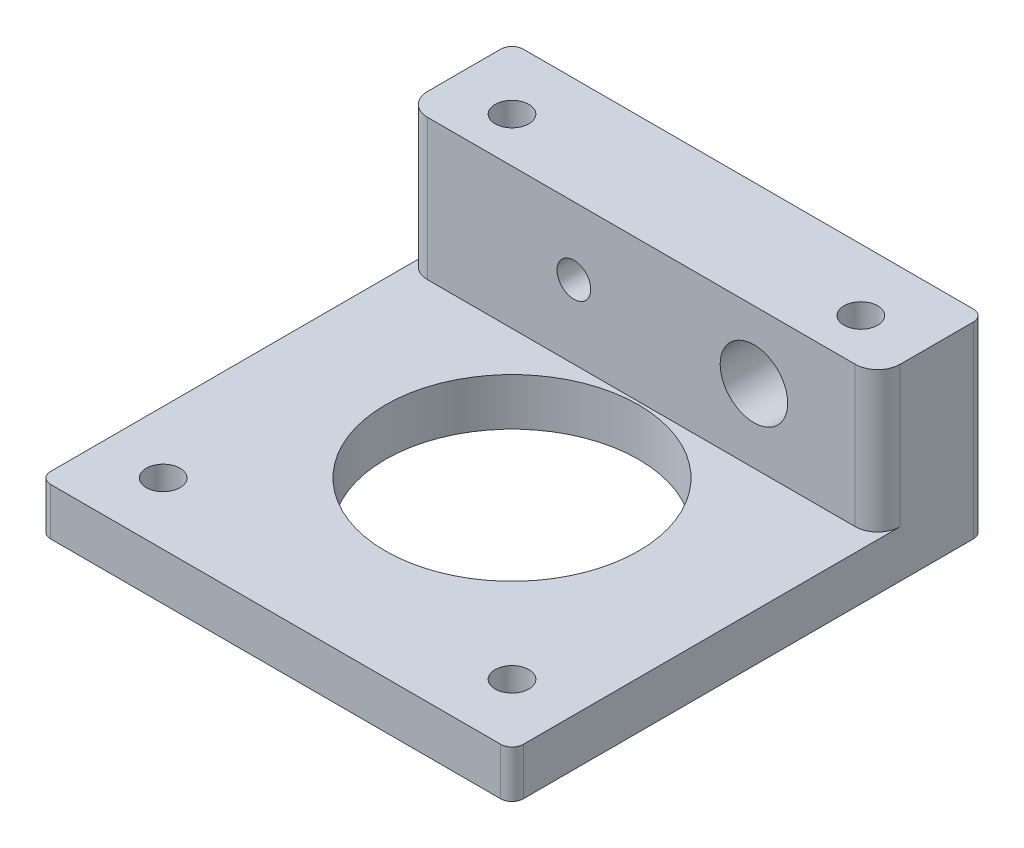
ISO-10303-21;
HEADER;
FILE_DESCRIPTION(('STEP AP214'),'2;1');
FILE_NAME('part.step','',(''),(''),'','','');
FILE_SCHEMA(('AUTOMOTIVE_DESIGN { 1 0 10303 214 1 1 1 1 }'));
ENDSEC;
DATA;
#1=APPLICATION_CONTEXT('core data for automotive mechanical design processes');
#2=APPLICATION_PROTOCOL_DEFINITION('international standard','automotive_design',2000,#1);
#3=PRODUCT_CONTEXT('',#1,'mechanical');
#4=PRODUCT('Part','Part','',(#3));
#5=PRODUCT_RELATED_PRODUCT_CATEGORY('part','',(#4));
#6=PRODUCT_DEFINITION_FORMATION('','',#4);
#7=PRODUCT_DEFINITION_CONTEXT('part definition',#1,'design');
#8=PRODUCT_DEFINITION('design','',#6,#7);
#9=PRODUCT_DEFINITION_SHAPE('','',#8);
#10=(LENGTH_UNIT() NAMED_UNIT(*) SI_UNIT(.MILLI.,.METRE.));
#11=(NAMED_UNIT(*) PLANE_ANGLE_UNIT() SI_UNIT($,.RADIAN.));
#12=(NAMED_UNIT(*) SI_UNIT($,.STERADIAN.) SOLID_ANGLE_UNIT());
#13=UNCERTAINTY_MEASURE_WITH_UNIT(LENGTH_MEASURE(1.E-05),#10,'distance_accuracy_value','');
#14=(GEOMETRIC_REPRESENTATION_CONTEXT(3) GLOBAL_UNCERTAINTY_ASSIGNED_CONTEXT((#13)) GLOBAL_UNIT_ASSIGNED_CONTEXT((#10,
#11,#12)) REPRESENTATION_CONTEXT('',''));
#15=CARTESIAN_POINT('',(0.,0.,0.));
#16=DIRECTION('',(0.,0.,1.));
#17=DIRECTION('',(1.,0.,0.));
#18=AXIS2_PLACEMENT_3D('',#15,#16,#17);
#19=CARTESIAN_POINT('',(-6.,10.7,21.));
#20=DIRECTION('',(0.,0.,-1.));
#21=DIRECTION('',(-1.,0.,0.));
#22=AXIS2_PLACEMENT_3D('',#19,#20,#21);
#23=CYLINDRICAL_SURFACE('',#22,1.5);
#24=CARTESIAN_POINT('',(-6.,10.7,-11.5));
#25=DIRECTION('',(0.,0.,-1.));
#26=DIRECTION('',(-1.,0.,0.));
#27=AXIS2_PLACEMENT_3D('',#24,#25,#26);
#28=CIRCLE('',#27,1.5);
#29=CARTESIAN_POINT('',(-7.5,10.7,-11.5));
#30=VERTEX_POINT('',#29);
#31=EDGE_CURVE('E168',#30,#30,#28,.T.);
#32=CARTESIAN_POINT('',(-6.,10.7,-19.));
#33=DIRECTION('',(0.,0.,-1.));
#34=DIRECTION('',(-1.,0.,0.));
#35=AXIS2_PLACEMENT_3D('',#32,#33,#34);
#36=CIRCLE('',#35,1.5);
#37=CARTESIAN_POINT('',(-7.5,10.7,-19.));
#38=VERTEX_POINT('',#37);
#39=EDGE_CURVE('E178',#38,#38,#36,.F.);
#40=CARTESIAN_POINT('',(-7.5,10.7,-11.5));
#41=CARTESIAN_POINT('',(-7.5,10.7,-11.578125));
#42=CARTESIAN_POINT('',(-7.5,10.7,-11.65625));
#43=CARTESIAN_POINT('',(-7.5,10.7,-11.8125));
#44=CARTESIAN_POINT('',(-7.5,10.7,-11.890625));
#45=CARTESIAN_POINT('',(-7.5,10.7,-12.046875));
#46=CARTESIAN_POINT('',(-7.5,10.7,-12.125));
#47=CARTESIAN_POINT('',(-7.5,10.7,-12.28125));
#48=CARTESIAN_POINT('',(-7.5,10.7,-12.359375));
#49=CARTESIAN_POINT('',(-7.5,10.7,-12.515625));
#50=CARTESIAN_POINT('',(-7.5,10.7,-12.59375));
#51=CARTESIAN_POINT('',(-7.5,10.7,-12.75));
#52=CARTESIAN_POINT('',(-7.5,10.7,-12.828125));
#53=CARTESIAN_POINT('',(-7.5,10.7,-12.984375));
#54=CARTESIAN_POINT('',(-7.5,10.7,-13.0625));
#55=CARTESIAN_POINT('',(-7.5,10.7,-13.21875));
#56=CARTESIAN_POINT('',(-7.5,10.7,-13.296875));
#57=CARTESIAN_POINT('',(-7.5,10.7,-13.453125));
#58=CARTESIAN_POINT('',(-7.5,10.7,-13.53125));
#59=CARTESIAN_POINT('',(-7.5,10.7,-13.6875));
#60=CARTESIAN_POINT('',(-7.5,10.7,-13.765625));
#61=CARTESIAN_POINT('',(-7.5,10.7,-13.921875));
#62=CARTESIAN_POINT('',(-7.5,10.7,-14.));
#63=CARTESIAN_POINT('',(-7.5,10.7,-14.15625));
#64=CARTESIAN_POINT('',(-7.5,10.7,-14.234375));
#65=CARTESIAN_POINT('',(-7.5,10.7,-14.390625));
#66=CARTESIAN_POINT('',(-7.5,10.7,-14.46875));
#67=CARTESIAN_POINT('',(-7.5,10.7,-14.625));
#68=CARTESIAN_POINT('',(-7.5,10.7,-14.703125));
#69=CARTESIAN_POINT('',(-7.5,10.7,-14.859375));
#70=CARTESIAN_POINT('',(-7.5,10.7,-14.9375));
#71=CARTESIAN_POINT('',(-7.5,10.7,-15.09375));
#72=CARTESIAN_POINT('',(-7.5,10.7,-15.171875));
#73=CARTESIAN_POINT('',(-7.5,10.7,-15.328125));
#74=CARTESIAN_POINT('',(-7.5,10.7,-15.40625));
#75=CARTESIAN_POINT('',(-7.5,10.7,-15.5625));
#76=CARTESIAN_POINT('',(-7.5,10.7,-15.640625));
#77=CARTESIAN_POINT('',(-7.5,10.7,-15.796875));
#78=CARTESIAN_POINT('',(-7.5,10.7,-15.875));
#79=CARTESIAN_POINT('',(-7.5,10.7,-16.03125));
#80=CARTESIAN_POINT('',(-7.5,10.7,-16.109375));
#81=CARTESIAN_POINT('',(-7.5,10.7,-16.265625));
#82=CARTESIAN_POINT('',(-7.5,10.7,-16.34375));
#83=CARTESIAN_POINT('',(-7.5,10.7,-16.5));
#84=CARTESIAN_POINT('',(-7.5,10.7,-16.578125));
#85=CARTESIAN_POINT('',(-7.5,10.7,-16.734375));
#86=CARTESIAN_POINT('',(-7.5,10.7,-16.8125));
#87=CARTESIAN_POINT('',(-7.5,10.7,-16.96875));
#88=CARTESIAN_POINT('',(-7.5,10.7,-17.046875));
#89=CARTESIAN_POINT('',(-7.5,10.7,-17.203125));
#90=CARTESIAN_POINT('',(-7.5,10.7,-17.28125));
#91=CARTESIAN_POINT('',(-7.5,10.7,-17.4375));
#92=CARTESIAN_POINT('',(-7.5,10.7,-17.515625));
#93=CARTESIAN_POINT('',(-7.5,10.7,-17.671875));
#94=CARTESIAN_POINT('',(-7.5,10.7,-17.75));
#95=CARTESIAN_POINT('',(-7.5,10.7,-17.90625));
#96=CARTESIAN_POINT('',(-7.5,10.7,-17.984375));
#97=CARTESIAN_POINT('',(-7.5,10.7,-18.140625));
#98=CARTESIAN_POINT('',(-7.5,10.7,-18.21875));
#99=CARTESIAN_POINT('',(-7.5,10.7,-18.375));
#100=CARTESIAN_POINT('',(-7.5,10.7,-18.453125));
#101=CARTESIAN_POINT('',(-7.5,10.7,-18.609375));
#102=CARTESIAN_POINT('',(-7.5,10.7,-18.6875));
#103=CARTESIAN_POINT('',(-7.5,10.7,-18.84375));
#104=CARTESIAN_POINT('',(-7.5,10.7,-18.921875));
#105=CARTESIAN_POINT('',(-7.5,10.7,-19.));
#106=B_SPLINE_CURVE_WITH_KNOTS('',3,(#40,#41,#42,#43,#44,#45,#46,#47,#48,#49,#50,#51,#52,#53,
#54,#55,#56,#57,#58,#59,#60,#61,#62,#63,#64,#65,#66,#67,#68,#69,#70,#71,#72,#73,#74,#75,#76,#77,
#78,#79,#80,#81,#82,#83,#84,#85,#86,#87,#88,#89,#90,#91,#92,#93,#94,#95,#96,#97,#98,#99,#100,
#101,#102,#103,#104,#105),.UNSPECIFIED.,.F.,.F.,(4,2,2,2,2,2,2,2,2,2,2,2,2,2,2,2,2,2,2,2,2,2,2,
2,2,2,2,2,2,2,2,2,4),(0.,0.234375000000002,0.468750000000004,0.703124999999999,
0.937500000000001,1.171875,1.40625,1.640625,1.875,2.109375,2.34375000000001,2.578125,2.8125,
3.046875,3.28125,3.515625,3.75,3.98437500000001,4.21875000000001,4.453125,4.6875,
4.92187500000001,5.15625,5.390625,5.62500000000001,5.85937500000001,6.09375000000001,6.328125,
6.56250000000001,6.79687500000001,7.03125,7.265625,7.50000000000001),.UNSPECIFIED.);
#107=EDGE_CURVE('BSEAM39',#30,#38,#106,.T.);
#108=ORIENTED_EDGE('',*,*,#31,.F.);
#109=ORIENTED_EDGE('',*,*,#39,.F.);
#110=ORIENTED_EDGE('',*,*,#107,.T.);
#111=ORIENTED_EDGE('',*,*,#107,.F.);
#112=EDGE_LOOP('',(#108,#110,#109,#111));
#113=FACE_BOUND('',#112,.T.);
#114=ADVANCED_FACE('F39',(#113),#23,.F.);
#115=CARTESIAN_POINT('',(0.,4.2,0.));
#116=DIRECTION('',(0.,1.,0.));
#117=DIRECTION('',(0.,0.,1.));
#118=AXIS2_PLACEMENT_3D('',#115,#116,#117);
#119=PLANE('',#118);
#120=CARTESIAN_POINT('',(0.,4.2,0.));
#121=DIRECTION('',(0.,1.,0.));
#122=DIRECTION('',(0.,0.,1.));
#123=AXIS2_PLACEMENT_3D('',#120,#121,#122);
#124=CIRCLE('',#123,11.25);
#125=CARTESIAN_POINT('',(0.,4.2,11.25));
#126=VERTEX_POINT('',#125);
#127=EDGE_CURVE('E177',#126,#126,#124,.T.);
#128=ORIENTED_EDGE('',*,*,#127,.F.);
#129=EDGE_LOOP('',(#128));
#130=FACE_BOUND('',#129,.T.);
#131=DIRECTION('',(0.,0.,1.));
#132=VECTOR('',#131,1.);
#133=CARTESIAN_POINT('',(-21.,4.2,-21.));
#134=LINE('',#133,#132);
#135=CARTESIAN_POINT('',(-21.,4.2,-13.5));
#136=VERTEX_POINT('',#135);
#137=CARTESIAN_POINT('',(-21.,4.2,20.));
#138=VERTEX_POINT('',#137);
#139=EDGE_CURVE('E55',#136,#138,#134,.T.);
#140=ORIENTED_EDGE('',*,*,#139,.T.);
#141=CARTESIAN_POINT('',(-20.,4.2,20.));
#142=DIRECTION('',(0.,1.,0.));
#143=DIRECTION('',(0.,0.,1.));
#144=AXIS2_PLACEMENT_3D('',#141,#142,#143);
#145=CIRCLE('',#144,1.);
#146=CARTESIAN_POINT('',(-20.,4.2,21.));
#147=VERTEX_POINT('',#146);
#148=EDGE_CURVE('E200',#138,#147,#145,.T.);
#149=ORIENTED_EDGE('',*,*,#148,.T.);
#150=DIRECTION('',(1.,0.,0.));
#151=VECTOR('',#150,1.);
#152=CARTESIAN_POINT('',(-21.,4.2,21.));
#153=LINE('',#152,#151);
#154=CARTESIAN_POINT('',(20.,4.2,21.));
#155=VERTEX_POINT('',#154);
#156=EDGE_CURVE('E149',#147,#155,#153,.T.);
#157=ORIENTED_EDGE('',*,*,#156,.T.);
#158=CARTESIAN_POINT('',(20.,4.2,20.));
#159=DIRECTION('',(0.,1.,0.));
#160=DIRECTION('',(0.,0.,1.));
#161=AXIS2_PLACEMENT_3D('',#158,#159,#160);
#162=CIRCLE('',#161,1.);
#163=CARTESIAN_POINT('',(21.,4.2,20.));
#164=VERTEX_POINT('',#163);
#165=EDGE_CURVE('E197',#155,#164,#162,.T.);
#166=ORIENTED_EDGE('',*,*,#165,.T.);
#167=DIRECTION('',(0.,0.,-1.));
#168=VECTOR('',#167,1.);
#169=CARTESIAN_POINT('',(21.,4.2,-21.));
#170=LINE('',#169,#168);
#171=CARTESIAN_POINT('',(21.,4.2,-13.5));
#172=VERTEX_POINT('',#171);
#173=EDGE_CURVE('E158',#164,#172,#170,.T.);
#174=ORIENTED_EDGE('',*,*,#173,.T.);
#175=CARTESIAN_POINT('',(19.,4.2,-13.5));
#176=DIRECTION('',(0.,1.,0.));
#177=DIRECTION('',(0.,0.,1.));
#178=AXIS2_PLACEMENT_3D('',#175,#176,#177);
#179=CIRCLE('',#178,2.);
#180=CARTESIAN_POINT('',(19.,4.2,-11.5));
#181=VERTEX_POINT('',#180);
#182=EDGE_CURVE('E48',#172,#181,#179,.F.);
#183=ORIENTED_EDGE('',*,*,#182,.T.);
#184=DIRECTION('',(1.,0.,0.));
#185=VECTOR('',#184,1.);
#186=CARTESIAN_POINT('',(-21.,4.2,-11.5));
#187=LINE('',#186,#185);
#188=CARTESIAN_POINT('',(-19.,4.2,-11.5));
#189=VERTEX_POINT('',#188);
#190=EDGE_CURVE('E249',#189,#181,#187,.T.);
#191=ORIENTED_EDGE('',*,*,#190,.F.);
#192=CARTESIAN_POINT('',(-19.,4.2,-13.5));
#193=DIRECTION('',(0.,1.,0.));
#194=DIRECTION('',(0.,0.,1.));
#195=AXIS2_PLACEMENT_3D('',#192,#193,#194);
#196=CIRCLE('',#195,2.);
#197=EDGE_CURVE('E11',#189,#136,#196,.F.);
#198=ORIENTED_EDGE('',*,*,#197,.T.);
#199=EDGE_LOOP('',(#140,#149,#157,#166,#174,#183,#191,#198));
#200=FACE_BOUND('',#199,.T.);
#201=CARTESIAN_POINT('',(15.5,4.2,15.5));
#202=DIRECTION('',(0.,1.,0.));
#203=DIRECTION('',(0.,0.,1.));
#204=AXIS2_PLACEMENT_3D('',#201,#202,#203);
#205=CIRCLE('',#204,1.5);
#206=CARTESIAN_POINT('',(15.5,4.2,17.));
#207=VERTEX_POINT('',#206);
#208=EDGE_CURVE('E295',#207,#207,#205,.T.);
#209=ORIENTED_EDGE('',*,*,#208,.F.);
#210=EDGE_LOOP('',(#209));
#211=FACE_BOUND('',#210,.T.);
#212=CARTESIAN_POINT('',(-15.5,4.2,15.5));
#213=DIRECTION('',(0.,1.,0.));
#214=DIRECTION('',(0.,0.,1.));
#215=AXIS2_PLACEMENT_3D('',#212,#213,#214);
#216=CIRCLE('',#215,1.5);
#217=CARTESIAN_POINT('',(-15.5,4.2,17.));
#218=VERTEX_POINT('',#217);
#219=EDGE_CURVE('E287',#218,#218,#216,.T.);
#220=ORIENTED_EDGE('',*,*,#219,.F.);
#221=EDGE_LOOP('',(#220));
#222=FACE_BOUND('',#221,.T.);
#223=ADVANCED_FACE('F247',(#130,#200,#211,#222),#119,.T.);
#224=CARTESIAN_POINT('',(0.,0.,0.));
#225=DIRECTION('',(0.,1.,0.));
#226=DIRECTION('',(0.,0.,1.));
#227=AXIS2_PLACEMENT_3D('',#224,#225,#226);
#228=PLANE('',#227);
#229=CARTESIAN_POINT('',(0.,0.,0.));
#230=DIRECTION('',(0.,1.,0.));
#231=DIRECTION('',(0.,0.,1.));
#232=AXIS2_PLACEMENT_3D('',#229,#230,#231);
#233=CIRCLE('',#232,11.25);
#234=CARTESIAN_POINT('',(0.,0.,11.25));
#235=VERTEX_POINT('',#234);
#236=EDGE_CURVE('E339',#235,#235,#233,.T.);
#237=ORIENTED_EDGE('',*,*,#236,.T.);
#238=EDGE_LOOP('',(#237));
#239=FACE_BOUND('',#238,.T.);
#240=DIRECTION('',(1.,0.,0.));
#241=VECTOR('',#240,1.);
#242=CARTESIAN_POINT('',(-21.,0.,21.));
#243=LINE('',#242,#241);
#244=CARTESIAN_POINT('',(-20.,0.,21.));
#245=VERTEX_POINT('',#244);
#246=CARTESIAN_POINT('',(20.,0.,21.));
#247=VERTEX_POINT('',#246);
#248=EDGE_CURVE('E146',#245,#247,#243,.T.);
#249=ORIENTED_EDGE('',*,*,#248,.F.);
#250=CARTESIAN_POINT('',(-20.,0.,20.));
#251=DIRECTION('',(0.,1.,0.));
#252=DIRECTION('',(0.,0.,1.));
#253=AXIS2_PLACEMENT_3D('',#250,#251,#252);
#254=CIRCLE('',#253,1.);
#255=CARTESIAN_POINT('',(-21.,0.,20.));
#256=VERTEX_POINT('',#255);
#257=EDGE_CURVE('E128',#245,#256,#254,.F.);
#258=ORIENTED_EDGE('',*,*,#257,.T.);
#259=DIRECTION('',(0.,0.,1.));
#260=VECTOR('',#259,1.);
#261=CARTESIAN_POINT('',(-21.,0.,-21.));
#262=LINE('',#261,#260);
#263=CARTESIAN_POINT('',(-21.,0.,-20.));
#264=VERTEX_POINT('',#263);
#265=EDGE_CURVE('E159',#264,#256,#262,.T.);
#266=ORIENTED_EDGE('',*,*,#265,.F.);
#267=CARTESIAN_POINT('',(-20.,0.,-20.));
#268=DIRECTION('',(0.,1.,0.));
#269=DIRECTION('',(0.,0.,1.));
#270=AXIS2_PLACEMENT_3D('',#267,#268,#269);
#271=CIRCLE('',#270,1.);
#272=CARTESIAN_POINT('',(-20.,0.,-21.));
#273=VERTEX_POINT('',#272);
#274=EDGE_CURVE('E151',#264,#273,#271,.F.);
#275=ORIENTED_EDGE('',*,*,#274,.T.);
#276=DIRECTION('',(-1.,0.,0.));
#277=VECTOR('',#276,1.);
#278=CARTESIAN_POINT('',(-21.,0.,-21.));
#279=LINE('',#278,#277);
#280=CARTESIAN_POINT('',(20.,0.,-21.));
#281=VERTEX_POINT('',#280);
#282=EDGE_CURVE('E164',#281,#273,#279,.T.);
#283=ORIENTED_EDGE('',*,*,#282,.F.);
#284=CARTESIAN_POINT('',(20.,0.,-20.));
#285=DIRECTION('',(0.,1.,0.));
#286=DIRECTION('',(0.,0.,1.));
#287=AXIS2_PLACEMENT_3D('',#284,#285,#286);
#288=CIRCLE('',#287,1.);
#289=CARTESIAN_POINT('',(21.,0.,-20.));
#290=VERTEX_POINT('',#289);
#291=EDGE_CURVE('E187',#281,#290,#288,.F.);
#292=ORIENTED_EDGE('',*,*,#291,.T.);
#293=DIRECTION('',(0.,0.,-1.));
#294=VECTOR('',#293,1.);
#295=CARTESIAN_POINT('',(21.,0.,-21.));
#296=LINE('',#295,#294);
#297=CARTESIAN_POINT('',(21.,0.,20.));
#298=VERTEX_POINT('',#297);
#299=EDGE_CURVE('E309',#298,#290,#296,.T.);
#300=ORIENTED_EDGE('',*,*,#299,.F.);
#301=CARTESIAN_POINT('',(20.,0.,20.));
#302=DIRECTION('',(0.,1.,0.));
#303=DIRECTION('',(0.,0.,1.));
#304=AXIS2_PLACEMENT_3D('',#301,#302,#303);
#305=CIRCLE('',#304,1.);
#306=EDGE_CURVE('E140',#298,#247,#305,.F.);
#307=ORIENTED_EDGE('',*,*,#306,.T.);
#308=EDGE_LOOP('',(#249,#258,#266,#275,#283,#292,#300,#307));
#309=FACE_BOUND('',#308,.T.);
#310=CARTESIAN_POINT('',(-15.5,0.,-15.5));
#311=DIRECTION('',(0.,1.,0.));
#312=DIRECTION('',(0.,0.,1.));
#313=AXIS2_PLACEMENT_3D('',#310,#311,#312);
#314=CIRCLE('',#313,1.5);
#315=CARTESIAN_POINT('',(-15.5,0.,-14.));
#316=VERTEX_POINT('',#315);
#317=EDGE_CURVE('E306',#316,#316,#314,.T.);
#318=ORIENTED_EDGE('',*,*,#317,.T.);
#319=EDGE_LOOP('',(#318));
#320=FACE_BOUND('',#319,.T.);
#321=CARTESIAN_POINT('',(15.5,0.,-15.5));
#322=DIRECTION('',(0.,1.,0.));
#323=DIRECTION('',(0.,0.,1.));
#324=AXIS2_PLACEMENT_3D('',#321,#322,#323);
#325=CIRCLE('',#324,1.5);
#326=CARTESIAN_POINT('',(15.5,0.,-14.));
#327=VERTEX_POINT('',#326);
#328=EDGE_CURVE('E299',#327,#327,#325,.T.);
#329=ORIENTED_EDGE('',*,*,#328,.T.);
#330=EDGE_LOOP('',(#329));
#331=FACE_BOUND('',#330,.T.);
#332=CARTESIAN_POINT('',(15.5,0.,15.5));
#333=DIRECTION('',(0.,1.,0.));
#334=DIRECTION('',(0.,0.,1.));
#335=AXIS2_PLACEMENT_3D('',#332,#333,#334);
#336=CIRCLE('',#335,1.5);
#337=CARTESIAN_POINT('',(15.5,0.,17.));
#338=VERTEX_POINT('',#337);
#339=EDGE_CURVE('E291',#338,#338,#336,.T.);
#340=ORIENTED_EDGE('',*,*,#339,.T.);
#341=EDGE_LOOP('',(#340));
#342=FACE_BOUND('',#341,.T.);
#343=CARTESIAN_POINT('',(-15.5,0.,15.5));
#344=DIRECTION('',(0.,1.,0.));
#345=DIRECTION('',(0.,0.,1.));
#346=AXIS2_PLACEMENT_3D('',#343,#344,#345);
#347=CIRCLE('',#346,1.5);
#348=CARTESIAN_POINT('',(-15.5,0.,17.));
#349=VERTEX_POINT('',#348);
#350=EDGE_CURVE('E282',#349,#349,#347,.T.);
#351=ORIENTED_EDGE('',*,*,#350,.T.);
#352=EDGE_LOOP('',(#351));
#353=FACE_BOUND('',#352,.T.);
#354=ADVANCED_FACE('F154',(#239,#309,#320,#331,#342,#353),#228,.F.);
#355=CARTESIAN_POINT('',(21.,4.2,-21.));
#356=DIRECTION('',(-1.,0.,0.));
#357=DIRECTION('',(0.,0.,1.));
#358=AXIS2_PLACEMENT_3D('',#355,#356,#357);
#359=PLANE('',#358);
#360=DIRECTION('',(0.,0.,-1.));
#361=VECTOR('',#360,1.);
#362=CARTESIAN_POINT('',(21.,16.7,-21.));
#363=LINE('',#362,#361);
#364=CARTESIAN_POINT('',(21.,16.7,-13.5));
#365=VERTEX_POINT('',#364);
#366=CARTESIAN_POINT('',(21.,16.7,-20.));
#367=VERTEX_POINT('',#366);
#368=EDGE_CURVE('E269',#365,#367,#363,.T.);
#369=ORIENTED_EDGE('',*,*,#368,.F.);
#370=DIRECTION('',(0.,-1.,0.));
#371=VECTOR('',#370,1.);
#372=CARTESIAN_POINT('',(21.,4.2,-13.5));
#373=LINE('',#372,#371);
#374=EDGE_CURVE('E224',#365,#172,#373,.T.);
#375=ORIENTED_EDGE('',*,*,#374,.T.);
#376=ORIENTED_EDGE('',*,*,#173,.F.);
#377=DIRECTION('',(0.,-1.,0.));
#378=VECTOR('',#377,1.);
#379=CARTESIAN_POINT('',(21.,4.2,20.));
#380=LINE('',#379,#378);
#381=EDGE_CURVE('E207',#164,#298,#380,.T.);
#382=ORIENTED_EDGE('',*,*,#381,.T.);
#383=ORIENTED_EDGE('',*,*,#299,.T.);
#384=DIRECTION('',(0.,-1.,0.));
#385=VECTOR('',#384,1.);
#386=CARTESIAN_POINT('',(21.,4.2,-20.));
#387=LINE('',#386,#385);
#388=EDGE_CURVE('E203',#290,#367,#387,.F.);
#389=ORIENTED_EDGE('',*,*,#388,.T.);
#390=EDGE_LOOP('',(#369,#375,#376,#382,#383,#389));
#391=FACE_BOUND('',#390,.T.);
#392=ADVANCED_FACE('F272',(#391),#359,.F.);
#393=CARTESIAN_POINT('',(-21.,4.2,-21.));
#394=DIRECTION('',(0.,0.,1.));
#395=DIRECTION('',(1.,0.,0.));
#396=AXIS2_PLACEMENT_3D('',#393,#394,#395);
#397=PLANE('',#396);
#398=CARTESIAN_POINT('',(-6.,10.7,-21.));
#399=DIRECTION('',(0.,0.,-1.));
#400=DIRECTION('',(-1.,0.,0.));
#401=AXIS2_PLACEMENT_3D('',#398,#399,#400);
#402=CIRCLE('',#401,3.5);
#403=CARTESIAN_POINT('',(-9.5,10.7,-21.));
#404=VERTEX_POINT('',#403);
#405=EDGE_CURVE('E349',#404,#404,#402,.T.);
#406=ORIENTED_EDGE('',*,*,#405,.F.);
#407=EDGE_LOOP('',(#406));
#408=FACE_BOUND('',#407,.T.);
#409=CARTESIAN_POINT('',(10.,10.7,-21.));
#410=DIRECTION('',(0.,0.,-1.));
#411=DIRECTION('',(-1.,0.,0.));
#412=AXIS2_PLACEMENT_3D('',#409,#410,#411);
#413=CIRCLE('',#412,3.);
#414=CARTESIAN_POINT('',(7.,10.7,-21.));
#415=VERTEX_POINT('',#414);
#416=EDGE_CURVE('E173',#415,#415,#413,.T.);
#417=ORIENTED_EDGE('',*,*,#416,.F.);
#418=EDGE_LOOP('',(#417));
#419=FACE_BOUND('',#418,.T.);
#420=DIRECTION('',(-1.,0.,0.));
#421=VECTOR('',#420,1.);
#422=CARTESIAN_POINT('',(-21.,16.7,-21.));
#423=LINE('',#422,#421);
#424=CARTESIAN_POINT('',(20.,16.7,-21.));
#425=VERTEX_POINT('',#424);
#426=CARTESIAN_POINT('',(-20.,16.7,-21.));
#427=VERTEX_POINT('',#426);
#428=EDGE_CURVE('E277',#425,#427,#423,.T.);
#429=ORIENTED_EDGE('',*,*,#428,.F.);
#430=DIRECTION('',(0.,-1.,0.));
#431=VECTOR('',#430,1.);
#432=CARTESIAN_POINT('',(20.,4.2,-21.));
#433=LINE('',#432,#431);
#434=EDGE_CURVE('E214',#425,#281,#433,.T.);
#435=ORIENTED_EDGE('',*,*,#434,.T.);
#436=ORIENTED_EDGE('',*,*,#282,.T.);
#437=DIRECTION('',(0.,-1.,0.));
#438=VECTOR('',#437,1.);
#439=CARTESIAN_POINT('',(-20.,4.2,-21.));
#440=LINE('',#439,#438);
#441=EDGE_CURVE('E211',#273,#427,#440,.F.);
#442=ORIENTED_EDGE('',*,*,#441,.T.);
#443=EDGE_LOOP('',(#429,#435,#436,#442));
#444=FACE_BOUND('',#443,.T.);
#445=ADVANCED_FACE('F322',(#408,#419,#444),#397,.F.);
#446=CARTESIAN_POINT('',(-21.,4.2,-21.));
#447=DIRECTION('',(1.,0.,0.));
#448=DIRECTION('',(0.,0.,-1.));
#449=AXIS2_PLACEMENT_3D('',#446,#447,#448);
#450=PLANE('',#449);
#451=ORIENTED_EDGE('',*,*,#139,.F.);
#452=DIRECTION('',(0.,-1.,0.));
#453=VECTOR('',#452,1.);
#454=CARTESIAN_POINT('',(-21.,4.2,-13.5));
#455=LINE('',#454,#453);
#456=CARTESIAN_POINT('',(-21.,16.7,-13.5));
#457=VERTEX_POINT('',#456);
#458=EDGE_CURVE('E59',#136,#457,#455,.F.);
#459=ORIENTED_EDGE('',*,*,#458,.T.);
#460=DIRECTION('',(0.,0.,1.));
#461=VECTOR('',#460,1.);
#462=CARTESIAN_POINT('',(-21.,16.7,-21.));
#463=LINE('',#462,#461);
#464=CARTESIAN_POINT('',(-21.,16.7,-20.));
#465=VERTEX_POINT('',#464);
#466=EDGE_CURVE('E260',#465,#457,#463,.T.);
#467=ORIENTED_EDGE('',*,*,#466,.F.);
#468=DIRECTION('',(0.,-1.,0.));
#469=VECTOR('',#468,1.);
#470=CARTESIAN_POINT('',(-21.,4.2,-20.));
#471=LINE('',#470,#469);
#472=EDGE_CURVE('E139',#465,#264,#471,.T.);
#473=ORIENTED_EDGE('',*,*,#472,.T.);
#474=ORIENTED_EDGE('',*,*,#265,.T.);
#475=DIRECTION('',(0.,-1.,0.));
#476=VECTOR('',#475,1.);
#477=CARTESIAN_POINT('',(-21.,4.2,20.));
#478=LINE('',#477,#476);
#479=EDGE_CURVE('E133',#256,#138,#478,.F.);
#480=ORIENTED_EDGE('',*,*,#479,.T.);
#481=EDGE_LOOP('',(#451,#459,#467,#473,#474,#480));
#482=FACE_BOUND('',#481,.T.);
#483=ADVANCED_FACE('F329',(#482),#450,.F.);
#484=CARTESIAN_POINT('',(-21.,4.2,21.));
#485=DIRECTION('',(0.,0.,-1.));
#486=DIRECTION('',(-1.,0.,0.));
#487=AXIS2_PLACEMENT_3D('',#484,#485,#486);
#488=PLANE('',#487);
#489=ORIENTED_EDGE('',*,*,#156,.F.);
#490=DIRECTION('',(0.,-1.,0.));
#491=VECTOR('',#490,1.);
#492=CARTESIAN_POINT('',(-20.,4.2,21.));
#493=LINE('',#492,#491);
#494=EDGE_CURVE('E132',#147,#245,#493,.T.);
#495=ORIENTED_EDGE('',*,*,#494,.T.);
#496=ORIENTED_EDGE('',*,*,#248,.T.);
#497=DIRECTION('',(0.,-1.,0.));
#498=VECTOR('',#497,1.);
#499=CARTESIAN_POINT('',(20.,4.2,21.));
#500=LINE('',#499,#498);
#501=EDGE_CURVE('E152',#247,#155,#500,.F.);
#502=ORIENTED_EDGE('',*,*,#501,.T.);
#503=EDGE_LOOP('',(#489,#495,#496,#502));
#504=FACE_BOUND('',#503,.T.);
#505=ADVANCED_FACE('F145',(#504),#488,.F.);
#506=CARTESIAN_POINT('',(-15.5,4.2,-15.5));
#507=DIRECTION('',(0.,-1.,0.));
#508=DIRECTION('',(0.,0.,-1.));
#509=AXIS2_PLACEMENT_3D('',#506,#507,#508);
#510=CYLINDRICAL_SURFACE('',#509,1.5);
#511=ORIENTED_EDGE('',*,*,#317,.F.);
#512=EDGE_LOOP('',(#511));
#513=FACE_BOUND('',#512,.T.);
#514=CARTESIAN_POINT('',(-15.5,16.7,-15.5));
#515=DIRECTION('',(0.,1.,0.));
#516=DIRECTION('',(0.,0.,1.));
#517=AXIS2_PLACEMENT_3D('',#514,#515,#516);
#518=CIRCLE('',#517,1.5);
#519=CARTESIAN_POINT('',(-15.5,16.7,-14.));
#520=VERTEX_POINT('',#519);
#521=EDGE_CURVE('E261',#520,#520,#518,.T.);
#522=ORIENTED_EDGE('',*,*,#521,.T.);
#523=EDGE_LOOP('',(#522));
#524=FACE_BOUND('',#523,.T.);
#525=ADVANCED_FACE('F409',(#513,#524),#510,.F.);
#526=CARTESIAN_POINT('',(15.5,4.2,-15.5));
#527=DIRECTION('',(0.,-1.,0.));
#528=DIRECTION('',(0.,0.,-1.));
#529=AXIS2_PLACEMENT_3D('',#526,#527,#528);
#530=CYLINDRICAL_SURFACE('',#529,1.5);
#531=ORIENTED_EDGE('',*,*,#328,.F.);
#532=EDGE_LOOP('',(#531));
#533=FACE_BOUND('',#532,.T.);
#534=CARTESIAN_POINT('',(15.5,16.7,-15.5));
#535=DIRECTION('',(0.,1.,0.));
#536=DIRECTION('',(0.,0.,1.));
#537=AXIS2_PLACEMENT_3D('',#534,#535,#536);
#538=CIRCLE('',#537,1.5);
#539=CARTESIAN_POINT('',(15.5,16.7,-14.));
#540=VERTEX_POINT('',#539);
#541=EDGE_CURVE('E335',#540,#540,#538,.T.);
#542=ORIENTED_EDGE('',*,*,#541,.T.);
#543=EDGE_LOOP('',(#542));
#544=FACE_BOUND('',#543,.T.);
#545=ADVANCED_FACE('F405',(#533,#544),#530,.F.);
#546=CARTESIAN_POINT('',(15.5,4.2,15.5));
#547=DIRECTION('',(0.,-1.,0.));
#548=DIRECTION('',(0.,0.,-1.));
#549=AXIS2_PLACEMENT_3D('',#546,#547,#548);
#550=CYLINDRICAL_SURFACE('',#549,1.5);
#551=ORIENTED_EDGE('',*,*,#208,.T.);
#552=EDGE_LOOP('',(#551));
#553=FACE_BOUND('',#552,.T.);
#554=ORIENTED_EDGE('',*,*,#339,.F.);
#555=EDGE_LOOP('',(#554));
#556=FACE_BOUND('',#555,.T.);
#557=ADVANCED_FACE('F401',(#553,#556),#550,.F.);
#558=CARTESIAN_POINT('',(-15.5,4.2,15.5));
#559=DIRECTION('',(0.,-1.,0.));
#560=DIRECTION('',(0.,0.,-1.));
#561=AXIS2_PLACEMENT_3D('',#558,#559,#560);
#562=CYLINDRICAL_SURFACE('',#561,1.5);
#563=ORIENTED_EDGE('',*,*,#219,.T.);
#564=EDGE_LOOP('',(#563));
#565=FACE_BOUND('',#564,.T.);
#566=ORIENTED_EDGE('',*,*,#350,.F.);
#567=EDGE_LOOP('',(#566));
#568=FACE_BOUND('',#567,.T.);
#569=ADVANCED_FACE('F396',(#565,#568),#562,.F.);
#570=CARTESIAN_POINT('',(0.,16.7,0.));
#571=DIRECTION('',(0.,1.,0.));
#572=DIRECTION('',(0.,0.,1.));
#573=AXIS2_PLACEMENT_3D('',#570,#571,#572);
#574=PLANE('',#573);
#575=ORIENTED_EDGE('',*,*,#521,.F.);
#576=EDGE_LOOP('',(#575));
#577=FACE_BOUND('',#576,.T.);
#578=DIRECTION('',(1.,0.,0.));
#579=VECTOR('',#578,1.);
#580=CARTESIAN_POINT('',(-21.,16.7,-11.5));
#581=LINE('',#580,#579);
#582=CARTESIAN_POINT('',(-19.,16.7,-11.5));
#583=VERTEX_POINT('',#582);
#584=CARTESIAN_POINT('',(19.,16.7,-11.5));
#585=VERTEX_POINT('',#584);
#586=EDGE_CURVE('E270',#583,#585,#581,.T.);
#587=ORIENTED_EDGE('',*,*,#586,.T.);
#588=CARTESIAN_POINT('',(19.,16.7,-13.5));
#589=DIRECTION('',(0.,1.,0.));
#590=DIRECTION('',(0.,0.,1.));
#591=AXIS2_PLACEMENT_3D('',#588,#589,#590);
#592=CIRCLE('',#591,2.);
#593=EDGE_CURVE('E238',#585,#365,#592,.T.);
#594=ORIENTED_EDGE('',*,*,#593,.T.);
#595=ORIENTED_EDGE('',*,*,#368,.T.);
#596=CARTESIAN_POINT('',(20.,16.7,-20.));
#597=DIRECTION('',(0.,1.,0.));
#598=DIRECTION('',(0.,0.,1.));
#599=AXIS2_PLACEMENT_3D('',#596,#597,#598);
#600=CIRCLE('',#599,1.);
#601=EDGE_CURVE('E221',#367,#425,#600,.T.);
#602=ORIENTED_EDGE('',*,*,#601,.T.);
#603=ORIENTED_EDGE('',*,*,#428,.T.);
#604=CARTESIAN_POINT('',(-20.,16.7,-20.));
#605=DIRECTION('',(0.,1.,0.));
#606=DIRECTION('',(0.,0.,1.));
#607=AXIS2_PLACEMENT_3D('',#604,#605,#606);
#608=CIRCLE('',#607,1.);
#609=EDGE_CURVE('E218',#427,#465,#608,.T.);
#610=ORIENTED_EDGE('',*,*,#609,.T.);
#611=ORIENTED_EDGE('',*,*,#466,.T.);
#612=CARTESIAN_POINT('',(-19.,16.7,-13.5));
#613=DIRECTION('',(0.,1.,0.));
#614=DIRECTION('',(0.,0.,1.));
#615=AXIS2_PLACEMENT_3D('',#612,#613,#614);
#616=CIRCLE('',#615,2.);
#617=EDGE_CURVE('E235',#457,#583,#616,.T.);
#618=ORIENTED_EDGE('',*,*,#617,.T.);
#619=EDGE_LOOP('',(#587,#594,#595,#602,#603,#610,#611,#618));
#620=FACE_BOUND('',#619,.T.);
#621=ORIENTED_EDGE('',*,*,#541,.F.);
#622=EDGE_LOOP('',(#621));
#623=FACE_BOUND('',#622,.T.);
#624=ADVANCED_FACE('F267',(#577,#620,#623),#574,.T.);
#625=CARTESIAN_POINT('',(-21.,16.7,-11.5));
#626=DIRECTION('',(0.,0.,-1.));
#627=DIRECTION('',(-1.,0.,0.));
#628=AXIS2_PLACEMENT_3D('',#625,#626,#627);
#629=PLANE('',#628);
#630=CARTESIAN_POINT('',(10.,10.7,-11.5));
#631=DIRECTION('',(0.,0.,-1.));
#632=DIRECTION('',(-1.,0.,0.));
#633=AXIS2_PLACEMENT_3D('',#630,#631,#632);
#634=CIRCLE('',#633,3.);
#635=CARTESIAN_POINT('',(7.,10.7,-11.5));
#636=VERTEX_POINT('',#635);
#637=EDGE_CURVE('E172',#636,#636,#634,.T.);
#638=ORIENTED_EDGE('',*,*,#637,.T.);
#639=EDGE_LOOP('',(#638));
#640=FACE_BOUND('',#639,.T.);
#641=ORIENTED_EDGE('',*,*,#31,.T.);
#642=EDGE_LOOP('',(#641));
#643=FACE_BOUND('',#642,.T.);
#644=ORIENTED_EDGE('',*,*,#190,.T.);
#645=DIRECTION('',(0.,-1.,0.));
#646=VECTOR('',#645,1.);
#647=CARTESIAN_POINT('',(19.,16.7,-11.5));
#648=LINE('',#647,#646);
#649=EDGE_CURVE('E232',#181,#585,#648,.F.);
#650=ORIENTED_EDGE('',*,*,#649,.T.);
#651=ORIENTED_EDGE('',*,*,#586,.F.);
#652=DIRECTION('',(0.,-1.,0.));
#653=VECTOR('',#652,1.);
#654=CARTESIAN_POINT('',(-19.,16.7,-11.5));
#655=LINE('',#654,#653);
#656=EDGE_CURVE('E228',#583,#189,#655,.T.);
#657=ORIENTED_EDGE('',*,*,#656,.T.);
#658=EDGE_LOOP('',(#644,#650,#651,#657));
#659=FACE_BOUND('',#658,.T.);
#660=ADVANCED_FACE('F255',(#640,#643,#659),#629,.F.);
#661=CARTESIAN_POINT('',(0.,0.,0.));
#662=DIRECTION('',(0.,1.,0.));
#663=DIRECTION('',(0.,0.,1.));
#664=AXIS2_PLACEMENT_3D('',#661,#662,#663);
#665=CYLINDRICAL_SURFACE('',#664,11.25);
#666=ORIENTED_EDGE('',*,*,#236,.F.);
#667=EDGE_LOOP('',(#666));
#668=FACE_BOUND('',#667,.T.);
#669=ORIENTED_EDGE('',*,*,#127,.T.);
#670=EDGE_LOOP('',(#669));
#671=FACE_BOUND('',#670,.T.);
#672=ADVANCED_FACE('F374',(#668,#671),#665,.F.);
#673=CARTESIAN_POINT('',(10.,10.7,21.));
#674=DIRECTION('',(0.,0.,-1.));
#675=DIRECTION('',(-1.,0.,0.));
#676=AXIS2_PLACEMENT_3D('',#673,#674,#675);
#677=CYLINDRICAL_SURFACE('',#676,3.);
#678=CARTESIAN_POINT('',(7.,10.7,-21.));
#679=CARTESIAN_POINT('',(7.,10.7,-20.9010416666667));
#680=CARTESIAN_POINT('',(7.,10.7,-20.8020833333333));
#681=CARTESIAN_POINT('',(7.,10.7,-20.6041666666667));
#682=CARTESIAN_POINT('',(7.,10.7,-20.5052083333333));
#683=CARTESIAN_POINT('',(7.,10.7,-20.3072916666667));
#684=CARTESIAN_POINT('',(7.,10.7,-20.2083333333333));
#685=CARTESIAN_POINT('',(7.,10.7,-20.0104166666667));
#686=CARTESIAN_POINT('',(7.,10.7,-19.9114583333333));
#687=CARTESIAN_POINT('',(7.,10.7,-19.7135416666667));
#688=CARTESIAN_POINT('',(7.,10.7,-19.6145833333333));
#689=CARTESIAN_POINT('',(7.,10.7,-19.4166666666667));
#690=CARTESIAN_POINT('',(7.,10.7,-19.3177083333333));
#691=CARTESIAN_POINT('',(7.,10.7,-19.1197916666667));
#692=CARTESIAN_POINT('',(7.,10.7,-19.0208333333333));
#693=CARTESIAN_POINT('',(7.,10.7,-18.8229166666667));
#694=CARTESIAN_POINT('',(7.,10.7,-18.7239583333333));
#695=CARTESIAN_POINT('',(7.,10.7,-18.5260416666667));
#696=CARTESIAN_POINT('',(7.,10.7,-18.4270833333333));
#697=CARTESIAN_POINT('',(7.,10.7,-18.2291666666667));
#698=CARTESIAN_POINT('',(7.,10.7,-18.1302083333333));
#699=CARTESIAN_POINT('',(7.,10.7,-17.9322916666667));
#700=CARTESIAN_POINT('',(7.,10.7,-17.8333333333333));
#701=CARTESIAN_POINT('',(7.,10.7,-17.6354166666667));
#702=CARTESIAN_POINT('',(7.,10.7,-17.5364583333333));
#703=CARTESIAN_POINT('',(7.,10.7,-17.3385416666667));
#704=CARTESIAN_POINT('',(7.,10.7,-17.2395833333333));
#705=CARTESIAN_POINT('',(7.,10.7,-17.0416666666667));
#706=CARTESIAN_POINT('',(7.,10.7,-16.9427083333333));
#707=CARTESIAN_POINT('',(7.,10.7,-16.7447916666667));
#708=CARTESIAN_POINT('',(7.,10.7,-16.6458333333333));
#709=CARTESIAN_POINT('',(7.,10.7,-16.4479166666667));
#710=CARTESIAN_POINT('',(7.,10.7,-16.3489583333333));
#711=CARTESIAN_POINT('',(7.,10.7,-16.1510416666667));
#712=CARTESIAN_POINT('',(7.,10.7,-16.0520833333333));
#713=CARTESIAN_POINT('',(7.,10.7,-15.8541666666667));
#714=CARTESIAN_POINT('',(7.,10.7,-15.7552083333333));
#715=CARTESIAN_POINT('',(7.,10.7,-15.5572916666667));
#716=CARTESIAN_POINT('',(7.,10.7,-15.4583333333333));
#717=CARTESIAN_POINT('',(7.,10.7,-15.2604166666667));
#718=CARTESIAN_POINT('',(7.,10.7,-15.1614583333333));
#719=CARTESIAN_POINT('',(7.,10.7,-14.9635416666667));
#720=CARTESIAN_POINT('',(7.,10.7,-14.8645833333333));
#721=CARTESIAN_POINT('',(7.,10.7,-14.6666666666667));
#722=CARTESIAN_POINT('',(7.,10.7,-14.5677083333333));
#723=CARTESIAN_POINT('',(7.,10.7,-14.3697916666667));
#724=CARTESIAN_POINT('',(7.,10.7,-14.2708333333333));
#725=CARTESIAN_POINT('',(7.,10.7,-14.0729166666667));
#726=CARTESIAN_POINT('',(7.,10.7,-13.9739583333333));
#727=CARTESIAN_POINT('',(7.,10.7,-13.7760416666667));
#728=CARTESIAN_POINT('',(7.,10.7,-13.6770833333333));
#729=CARTESIAN_POINT('',(7.,10.7,-13.4791666666667));
#730=CARTESIAN_POINT('',(7.,10.7,-13.3802083333333));
#731=CARTESIAN_POINT('',(7.,10.7,-13.1822916666667));
#732=CARTESIAN_POINT('',(7.,10.7,-13.0833333333333));
#733=CARTESIAN_POINT('',(7.,10.7,-12.8854166666667));
#734=CARTESIAN_POINT('',(7.,10.7,-12.7864583333333));
#735=CARTESIAN_POINT('',(7.,10.7,-12.5885416666667));
#736=CARTESIAN_POINT('',(7.,10.7,-12.4895833333333));
#737=CARTESIAN_POINT('',(7.,10.7,-12.2916666666667));
#738=CARTESIAN_POINT('',(7.,10.7,-12.1927083333333));
#739=CARTESIAN_POINT('',(7.,10.7,-11.9947916666667));
#740=CARTESIAN_POINT('',(7.,10.7,-11.8958333333333));
#741=CARTESIAN_POINT('',(7.,10.7,-11.6979166666667));
#742=CARTESIAN_POINT('',(7.,10.7,-11.5989583333333));
#743=CARTESIAN_POINT('',(7.,10.7,-11.5));
#744=B_SPLINE_CURVE_WITH_KNOTS('',3,(#678,#679,#680,#681,#682,#683,#684,#685,#686,#687,#688,
#689,#690,#691,#692,#693,#694,#695,#696,#697,#698,#699,#700,#701,#702,#703,#704,#705,#706,#707,
#708,#709,#710,#711,#712,#713,#714,#715,#716,#717,#718,#719,#720,#721,#722,#723,#724,#725,#726,
#727,#728,#729,#730,#731,#732,#733,#734,#735,#736,#737,#738,#739,#740,#741,#742,#743),
.UNSPECIFIED.,.F.,.F.,(4,2,2,2,2,2,2,2,2,2,2,2,2,2,2,2,2,2,2,2,2,2,2,2,2,2,2,2,2,2,2,2,4),(0.,
0.296875000000002,0.593750000000004,0.890624999999999,1.1875,1.484375,1.78125,2.078125,2.375,
2.671875,2.96875000000001,3.265625,3.5625,3.85937500000001,4.15625,4.453125,4.75,
5.04687500000001,5.34375000000001,5.640625,5.93750000000001,6.23437500000001,6.53125,6.828125,
7.12500000000001,7.42187500000001,7.71875000000001,8.01562500000001,8.31250000000001,
8.60937500000001,8.90625,9.20312500000001,9.50000000000001),.UNSPECIFIED.);
#745=EDGE_CURVE('BSEAM371',#415,#636,#744,.T.);
#746=ORIENTED_EDGE('',*,*,#416,.T.);
#747=ORIENTED_EDGE('',*,*,#637,.F.);
#748=ORIENTED_EDGE('',*,*,#745,.T.);
#749=ORIENTED_EDGE('',*,*,#745,.F.);
#750=EDGE_LOOP('',(#746,#748,#747,#749));
#751=FACE_BOUND('',#750,.T.);
#752=ADVANCED_FACE('F371',(#751),#677,.F.);
#753=CARTESIAN_POINT('',(-6.,10.7,-19.));
#754=DIRECTION('',(0.,0.,-1.));
#755=DIRECTION('',(-1.,0.,0.));
#756=AXIS2_PLACEMENT_3D('',#753,#754,#755);
#757=PLANE('',#756);
#758=CARTESIAN_POINT('',(-6.,10.7,-19.));
#759=DIRECTION('',(0.,0.,-1.));
#760=DIRECTION('',(-1.,0.,0.));
#761=AXIS2_PLACEMENT_3D('',#758,#759,#760);
#762=CIRCLE('',#761,3.5);
#763=CARTESIAN_POINT('',(-9.5,10.7,-19.));
#764=VERTEX_POINT('',#763);
#765=EDGE_CURVE('E182',#764,#764,#762,.T.);
#766=ORIENTED_EDGE('',*,*,#765,.T.);
#767=EDGE_LOOP('',(#766));
#768=FACE_BOUND('',#767,.T.);
#769=ORIENTED_EDGE('',*,*,#39,.T.);
#770=EDGE_LOOP('',(#769));
#771=FACE_BOUND('',#770,.T.);
#772=ADVANCED_FACE('F357',(#768,#771),#757,.T.);
#773=CARTESIAN_POINT('',(-6.,10.7,-19.));
#774=DIRECTION('',(0.,0.,-1.));
#775=DIRECTION('',(-1.,0.,0.));
#776=AXIS2_PLACEMENT_3D('',#773,#774,#775);
#777=CYLINDRICAL_SURFACE('',#776,3.5);
#778=ORIENTED_EDGE('',*,*,#765,.F.);
#779=EDGE_LOOP('',(#778));
#780=FACE_BOUND('',#779,.T.);
#781=ORIENTED_EDGE('',*,*,#405,.T.);
#782=EDGE_LOOP('',(#781));
#783=FACE_BOUND('',#782,.T.);
#784=ADVANCED_FACE('F360',(#780,#783),#777,.F.);
#785=CARTESIAN_POINT('',(-20.,4.2,20.));
#786=DIRECTION('',(0.,-1.,0.));
#787=DIRECTION('',(0.,0.,-1.));
#788=AXIS2_PLACEMENT_3D('',#785,#786,#787);
#789=CYLINDRICAL_SURFACE('',#788,1.);
#790=ORIENTED_EDGE('',*,*,#148,.F.);
#791=ORIENTED_EDGE('',*,*,#479,.F.);
#792=ORIENTED_EDGE('',*,*,#257,.F.);
#793=ORIENTED_EDGE('',*,*,#494,.F.);
#794=EDGE_LOOP('',(#790,#791,#792,#793));
#795=FACE_BOUND('',#794,.T.);
#796=ADVANCED_FACE('F131',(#795),#789,.T.);
#797=CARTESIAN_POINT('',(20.,4.2,20.));
#798=DIRECTION('',(0.,-1.,0.));
#799=DIRECTION('',(0.,0.,-1.));
#800=AXIS2_PLACEMENT_3D('',#797,#798,#799);
#801=CYLINDRICAL_SURFACE('',#800,1.);
#802=ORIENTED_EDGE('',*,*,#165,.F.);
#803=ORIENTED_EDGE('',*,*,#501,.F.);
#804=ORIENTED_EDGE('',*,*,#306,.F.);
#805=ORIENTED_EDGE('',*,*,#381,.F.);
#806=EDGE_LOOP('',(#802,#803,#804,#805));
#807=FACE_BOUND('',#806,.T.);
#808=ADVANCED_FACE('F428',(#807),#801,.T.);
#809=CARTESIAN_POINT('',(20.,4.2,-20.));
#810=DIRECTION('',(0.,-1.,0.));
#811=DIRECTION('',(0.,0.,-1.));
#812=AXIS2_PLACEMENT_3D('',#809,#810,#811);
#813=CYLINDRICAL_SURFACE('',#812,1.);
#814=ORIENTED_EDGE('',*,*,#601,.F.);
#815=ORIENTED_EDGE('',*,*,#388,.F.);
#816=ORIENTED_EDGE('',*,*,#291,.F.);
#817=ORIENTED_EDGE('',*,*,#434,.F.);
#818=EDGE_LOOP('',(#814,#815,#816,#817));
#819=FACE_BOUND('',#818,.T.);
#820=ADVANCED_FACE('F431',(#819),#813,.T.);
#821=CARTESIAN_POINT('',(-20.,4.2,-20.));
#822=DIRECTION('',(0.,-1.,0.));
#823=DIRECTION('',(0.,0.,-1.));
#824=AXIS2_PLACEMENT_3D('',#821,#822,#823);
#825=CYLINDRICAL_SURFACE('',#824,1.);
#826=ORIENTED_EDGE('',*,*,#609,.F.);
#827=ORIENTED_EDGE('',*,*,#441,.F.);
#828=ORIENTED_EDGE('',*,*,#274,.F.);
#829=ORIENTED_EDGE('',*,*,#472,.F.);
#830=EDGE_LOOP('',(#826,#827,#828,#829));
#831=FACE_BOUND('',#830,.T.);
#832=ADVANCED_FACE('F326',(#831),#825,.T.);
#833=CARTESIAN_POINT('',(19.,4.2,-13.5));
#834=DIRECTION('',(0.,-1.,0.));
#835=DIRECTION('',(0.,0.,-1.));
#836=AXIS2_PLACEMENT_3D('',#833,#834,#835);
#837=CYLINDRICAL_SURFACE('',#836,2.);
#838=ORIENTED_EDGE('',*,*,#593,.F.);
#839=ORIENTED_EDGE('',*,*,#649,.F.);
#840=ORIENTED_EDGE('',*,*,#182,.F.);
#841=ORIENTED_EDGE('',*,*,#374,.F.);
#842=EDGE_LOOP('',(#838,#839,#840,#841));
#843=FACE_BOUND('',#842,.T.);
#844=ADVANCED_FACE('F264',(#843),#837,.T.);
#845=CARTESIAN_POINT('',(-19.,16.7,-13.5));
#846=DIRECTION('',(0.,-1.,0.));
#847=DIRECTION('',(0.,0.,-1.));
#848=AXIS2_PLACEMENT_3D('',#845,#846,#847);
#849=CYLINDRICAL_SURFACE('',#848,2.);
#850=ORIENTED_EDGE('',*,*,#617,.F.);
#851=ORIENTED_EDGE('',*,*,#458,.F.);
#852=ORIENTED_EDGE('',*,*,#197,.F.);
#853=ORIENTED_EDGE('',*,*,#656,.F.);
#854=EDGE_LOOP('',(#850,#851,#852,#853));
#855=FACE_BOUND('',#854,.T.);
#856=ADVANCED_FACE('F41',(#855),#849,.T.);
#857=CLOSED_SHELL('',(#114,#223,#354,#392,#445,#483,#505,#525,#545,#557,#569,#624,#660,#672,
#752,#772,#784,#796,#808,#820,#832,#844,#856));
#858=MANIFOLD_SOLID_BREP('B2',#857);
#859=ADVANCED_BREP_SHAPE_REPRESENTATION('',(#18,#858),#14);
#860=SHAPE_DEFINITION_REPRESENTATION(#9,#859);
ENDSEC;
END-ISO-10303-21;
